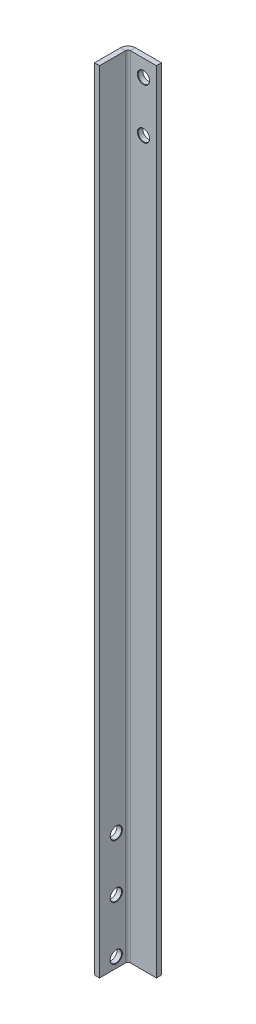
ISO-10303-21;
HEADER;
FILE_DESCRIPTION(('STEP AP214'),'2;1');
FILE_NAME('part.step','',(''),(''),'','','');
FILE_SCHEMA(('AUTOMOTIVE_DESIGN { 1 0 10303 214 1 1 1 1 }'));
ENDSEC;
DATA;
#1=APPLICATION_CONTEXT('core data for automotive mechanical design processes');
#2=APPLICATION_PROTOCOL_DEFINITION('international standard','automotive_design',2000,#1);
#3=PRODUCT_CONTEXT('',#1,'mechanical');
#4=PRODUCT('Part','Part','',(#3));
#5=PRODUCT_RELATED_PRODUCT_CATEGORY('part','',(#4));
#6=PRODUCT_DEFINITION_FORMATION('','',#4);
#7=PRODUCT_DEFINITION_CONTEXT('part definition',#1,'design');
#8=PRODUCT_DEFINITION('design','',#6,#7);
#9=PRODUCT_DEFINITION_SHAPE('','',#8);
#10=(LENGTH_UNIT() NAMED_UNIT(*) SI_UNIT(.MILLI.,.METRE.));
#11=(NAMED_UNIT(*) PLANE_ANGLE_UNIT() SI_UNIT($,.RADIAN.));
#12=(NAMED_UNIT(*) SI_UNIT($,.STERADIAN.) SOLID_ANGLE_UNIT());
#13=UNCERTAINTY_MEASURE_WITH_UNIT(LENGTH_MEASURE(1.E-05),#10,'distance_accuracy_value','');
#14=(GEOMETRIC_REPRESENTATION_CONTEXT(3) GLOBAL_UNCERTAINTY_ASSIGNED_CONTEXT((#13)) GLOBAL_UNIT_ASSIGNED_CONTEXT((#10,
#11,#12)) REPRESENTATION_CONTEXT('',''));
#15=CARTESIAN_POINT('',(0.,0.,0.));
#16=DIRECTION('',(0.,0.,1.));
#17=DIRECTION('',(1.,0.,0.));
#18=AXIS2_PLACEMENT_3D('',#15,#16,#17);
#19=CARTESIAN_POINT('',(2.2366,118.,0.));
#20=DIRECTION('',(0.,1.,0.));
#21=DIRECTION('',(0.,0.,1.));
#22=AXIS2_PLACEMENT_3D('',#19,#20,#21);
#23=PLANE('',#22);
#24=DIRECTION('',(0.,0.,1.));
#25=VECTOR('',#24,1.);
#26=CARTESIAN_POINT('',(2.2366,118.,0.));
#27=LINE('',#26,#25);
#28=CARTESIAN_POINT('',(2.2366,118.,0.));
#29=VERTEX_POINT('',#28);
#30=CARTESIAN_POINT('',(2.2366,118.,1.5));
#31=VERTEX_POINT('',#30);
#32=EDGE_CURVE('E11',#29,#31,#27,.T.);
#33=ORIENTED_EDGE('',*,*,#32,.F.);
#34=CARTESIAN_POINT('',(2.2366,118.,2.2366));
#35=DIRECTION('',(0.,1.,0.));
#36=DIRECTION('',(0.,0.,1.));
#37=AXIS2_PLACEMENT_3D('',#34,#35,#36);
#38=CIRCLE('',#37,2.2366);
#39=CARTESIAN_POINT('',(0.,118.,2.2366));
#40=VERTEX_POINT('',#39);
#41=EDGE_CURVE('E142',#40,#29,#38,.F.);
#42=ORIENTED_EDGE('',*,*,#41,.F.);
#43=DIRECTION('',(-1.,0.,0.));
#44=VECTOR('',#43,1.);
#45=CARTESIAN_POINT('',(1.5,118.,2.2366));
#46=LINE('',#45,#44);
#47=CARTESIAN_POINT('',(1.5,118.,2.2366));
#48=VERTEX_POINT('',#47);
#49=EDGE_CURVE('E53',#48,#40,#46,.T.);
#50=ORIENTED_EDGE('',*,*,#49,.F.);
#51=CARTESIAN_POINT('',(2.2366,118.,2.2366));
#52=DIRECTION('',(0.,1.,0.));
#53=DIRECTION('',(1.,0.,0.));
#54=AXIS2_PLACEMENT_3D('',#51,#52,#53);
#55=CIRCLE('',#54,0.7366);
#56=EDGE_CURVE('E135',#48,#31,#55,.F.);
#57=ORIENTED_EDGE('',*,*,#56,.T.);
#58=EDGE_LOOP('',(#33,#42,#50,#57));
#59=FACE_BOUND('',#58,.T.);
#60=ADVANCED_FACE('F45',(#59),#23,.T.);
#61=CARTESIAN_POINT('',(1.5,118.,2.2366));
#62=DIRECTION('',(0.,1.,0.));
#63=DIRECTION('',(0.,0.,1.));
#64=AXIS2_PLACEMENT_3D('',#61,#62,#63);
#65=PLANE('',#64);
#66=DIRECTION('',(1.,0.,0.));
#67=VECTOR('',#66,1.);
#68=CARTESIAN_POINT('',(0.,118.,0.));
#69=LINE('',#68,#67);
#70=CARTESIAN_POINT('',(10.,118.,0.));
#71=VERTEX_POINT('',#70);
#72=EDGE_CURVE('E192',#29,#71,#69,.T.);
#73=ORIENTED_EDGE('',*,*,#72,.F.);
#74=ORIENTED_EDGE('',*,*,#32,.T.);
#75=DIRECTION('',(1.,0.,0.));
#76=VECTOR('',#75,1.);
#77=CARTESIAN_POINT('',(0.,118.,1.5));
#78=LINE('',#77,#76);
#79=CARTESIAN_POINT('',(10.,118.,1.5));
#80=VERTEX_POINT('',#79);
#81=EDGE_CURVE('E101',#31,#80,#78,.T.);
#82=ORIENTED_EDGE('',*,*,#81,.T.);
#83=DIRECTION('',(0.,0.,1.));
#84=VECTOR('',#83,1.);
#85=CARTESIAN_POINT('',(10.,118.,0.));
#86=LINE('',#85,#84);
#87=EDGE_CURVE('E481',#71,#80,#86,.T.);
#88=ORIENTED_EDGE('',*,*,#87,.F.);
#89=EDGE_LOOP('',(#73,#74,#82,#88));
#90=FACE_BOUND('',#89,.T.);
#91=ADVANCED_FACE('F200',(#90),#65,.T.);
#92=CARTESIAN_POINT('',(0.,-118.,2.2366));
#93=DIRECTION('',(0.,-1.,0.));
#94=DIRECTION('',(0.,0.,-1.));
#95=AXIS2_PLACEMENT_3D('',#92,#93,#94);
#96=PLANE('',#95);
#97=DIRECTION('',(1.,0.,0.));
#98=VECTOR('',#97,1.);
#99=CARTESIAN_POINT('',(0.,-118.,2.2366));
#100=LINE('',#99,#98);
#101=CARTESIAN_POINT('',(0.,-118.,2.2366));
#102=VERTEX_POINT('',#101);
#103=CARTESIAN_POINT('',(1.5,-118.,2.2366));
#104=VERTEX_POINT('',#103);
#105=EDGE_CURVE('E88',#102,#104,#100,.T.);
#106=ORIENTED_EDGE('',*,*,#105,.F.);
#107=CARTESIAN_POINT('',(2.2366,-118.,2.2366));
#108=DIRECTION('',(0.,1.,0.));
#109=DIRECTION('',(0.,0.,1.));
#110=AXIS2_PLACEMENT_3D('',#107,#108,#109);
#111=CIRCLE('',#110,2.2366);
#112=CARTESIAN_POINT('',(2.2366,-118.,0.));
#113=VERTEX_POINT('',#112);
#114=EDGE_CURVE('E158',#102,#113,#111,.F.);
#115=ORIENTED_EDGE('',*,*,#114,.T.);
#116=DIRECTION('',(0.,0.,-1.));
#117=VECTOR('',#116,1.);
#118=CARTESIAN_POINT('',(2.2366,-118.,1.5));
#119=LINE('',#118,#117);
#120=CARTESIAN_POINT('',(2.2366,-118.,1.5));
#121=VERTEX_POINT('',#120);
#122=EDGE_CURVE('E95',#121,#113,#119,.T.);
#123=ORIENTED_EDGE('',*,*,#122,.F.);
#124=CARTESIAN_POINT('',(2.2366,-118.,2.2366));
#125=DIRECTION('',(0.,1.,0.));
#126=DIRECTION('',(1.,0.,0.));
#127=AXIS2_PLACEMENT_3D('',#124,#125,#126);
#128=CIRCLE('',#127,0.7366);
#129=EDGE_CURVE('E165',#104,#121,#128,.F.);
#130=ORIENTED_EDGE('',*,*,#129,.F.);
#131=EDGE_LOOP('',(#106,#115,#123,#130));
#132=FACE_BOUND('',#131,.T.);
#133=ADVANCED_FACE('F198',(#132),#96,.T.);
#134=CARTESIAN_POINT('',(2.2366,-118.,1.5));
#135=DIRECTION('',(0.,-1.,0.));
#136=DIRECTION('',(0.,0.,-1.));
#137=AXIS2_PLACEMENT_3D('',#134,#135,#136);
#138=PLANE('',#137);
#139=DIRECTION('',(0.,0.,-1.));
#140=VECTOR('',#139,1.);
#141=CARTESIAN_POINT('',(0.,-118.,10.));
#142=LINE('',#141,#140);
#143=CARTESIAN_POINT('',(0.,-118.,10.));
#144=VERTEX_POINT('',#143);
#145=EDGE_CURVE('E160',#144,#102,#142,.T.);
#146=ORIENTED_EDGE('',*,*,#145,.T.);
#147=ORIENTED_EDGE('',*,*,#105,.T.);
#148=DIRECTION('',(0.,0.,-1.));
#149=VECTOR('',#148,1.);
#150=CARTESIAN_POINT('',(1.5,-118.,10.));
#151=LINE('',#150,#149);
#152=CARTESIAN_POINT('',(1.5,-118.,10.));
#153=VERTEX_POINT('',#152);
#154=EDGE_CURVE('E163',#153,#104,#151,.T.);
#155=ORIENTED_EDGE('',*,*,#154,.F.);
#156=DIRECTION('',(-1.,0.,0.));
#157=VECTOR('',#156,1.);
#158=CARTESIAN_POINT('',(1.5,-118.,10.));
#159=LINE('',#158,#157);
#160=EDGE_CURVE('E123',#153,#144,#159,.T.);
#161=ORIENTED_EDGE('',*,*,#160,.T.);
#162=EDGE_LOOP('',(#146,#147,#155,#161));
#163=FACE_BOUND('',#162,.T.);
#164=ADVANCED_FACE('F194',(#163),#138,.T.);
#165=CARTESIAN_POINT('',(0.,118.,1.5));
#166=DIRECTION('',(0.,0.,-1.));
#167=DIRECTION('',(-1.,0.,0.));
#168=AXIS2_PLACEMENT_3D('',#165,#166,#167);
#169=PLANE('',#168);
#170=CARTESIAN_POINT('',(6.1183,113.,1.5));
#171=DIRECTION('',(0.,0.,1.));
#172=DIRECTION('',(1.,0.,0.));
#173=AXIS2_PLACEMENT_3D('',#170,#171,#172);
#174=CIRCLE('',#173,1.825);
#175=CARTESIAN_POINT('',(7.9433,113.,1.5));
#176=VERTEX_POINT('',#175);
#177=EDGE_CURVE('E463',#176,#176,#174,.T.);
#178=ORIENTED_EDGE('',*,*,#177,.F.);
#179=EDGE_LOOP('',(#178));
#180=FACE_BOUND('',#179,.T.);
#181=CARTESIAN_POINT('',(6.1183,98.,1.5));
#182=DIRECTION('',(0.,0.,1.));
#183=DIRECTION('',(1.,0.,0.));
#184=AXIS2_PLACEMENT_3D('',#181,#182,#183);
#185=CIRCLE('',#184,1.825);
#186=CARTESIAN_POINT('',(7.9433,98.,1.5));
#187=VERTEX_POINT('',#186);
#188=EDGE_CURVE('E472',#187,#187,#185,.T.);
#189=ORIENTED_EDGE('',*,*,#188,.F.);
#190=EDGE_LOOP('',(#189));
#191=FACE_BOUND('',#190,.T.);
#192=DIRECTION('',(1.,0.,0.));
#193=VECTOR('',#192,1.);
#194=CARTESIAN_POINT('',(0.,-118.,1.5));
#195=LINE('',#194,#193);
#196=CARTESIAN_POINT('',(10.,-118.,1.5));
#197=VERTEX_POINT('',#196);
#198=EDGE_CURVE('E148',#121,#197,#195,.T.);
#199=ORIENTED_EDGE('',*,*,#198,.T.);
#200=DIRECTION('',(0.,-1.,0.));
#201=VECTOR('',#200,1.);
#202=CARTESIAN_POINT('',(10.,118.,1.5));
#203=LINE('',#202,#201);
#204=EDGE_CURVE('E179',#80,#197,#203,.T.);
#205=ORIENTED_EDGE('',*,*,#204,.F.);
#206=ORIENTED_EDGE('',*,*,#81,.F.);
#207=DIRECTION('',(0.,-1.,0.));
#208=VECTOR('',#207,1.);
#209=CARTESIAN_POINT('',(2.2366,118.,1.5));
#210=LINE('',#209,#208);
#211=EDGE_CURVE('E147',#31,#121,#210,.T.);
#212=ORIENTED_EDGE('',*,*,#211,.T.);
#213=EDGE_LOOP('',(#199,#205,#206,#212));
#214=FACE_BOUND('',#213,.T.);
#215=ADVANCED_FACE('F206',(#180,#191,#214),#169,.F.);
#216=CARTESIAN_POINT('',(10.,118.,0.));
#217=DIRECTION('',(1.,0.,0.));
#218=DIRECTION('',(0.,0.,-1.));
#219=AXIS2_PLACEMENT_3D('',#216,#217,#218);
#220=PLANE('',#219);
#221=DIRECTION('',(0.,0.,1.));
#222=VECTOR('',#221,1.);
#223=CARTESIAN_POINT('',(10.,-118.,0.));
#224=LINE('',#223,#222);
#225=CARTESIAN_POINT('',(10.,-118.,0.));
#226=VERTEX_POINT('',#225);
#227=EDGE_CURVE('E151',#226,#197,#224,.T.);
#228=ORIENTED_EDGE('',*,*,#227,.F.);
#229=DIRECTION('',(0.,-1.,0.));
#230=VECTOR('',#229,1.);
#231=CARTESIAN_POINT('',(10.,118.,0.));
#232=LINE('',#231,#230);
#233=EDGE_CURVE('E177',#71,#226,#232,.T.);
#234=ORIENTED_EDGE('',*,*,#233,.F.);
#235=ORIENTED_EDGE('',*,*,#87,.T.);
#236=ORIENTED_EDGE('',*,*,#204,.T.);
#237=EDGE_LOOP('',(#228,#234,#235,#236));
#238=FACE_BOUND('',#237,.T.);
#239=ADVANCED_FACE('F240',(#238),#220,.T.);
#240=CARTESIAN_POINT('',(0.,118.,0.));
#241=DIRECTION('',(0.,0.,-1.));
#242=DIRECTION('',(-1.,0.,0.));
#243=AXIS2_PLACEMENT_3D('',#240,#241,#242);
#244=PLANE('',#243);
#245=CARTESIAN_POINT('',(6.1183,113.,0.));
#246=DIRECTION('',(0.,0.,1.));
#247=DIRECTION('',(1.,0.,0.));
#248=AXIS2_PLACEMENT_3D('',#245,#246,#247);
#249=CIRCLE('',#248,1.7);
#250=CARTESIAN_POINT('',(7.8183,113.,0.));
#251=VERTEX_POINT('',#250);
#252=EDGE_CURVE('E469',#251,#251,#249,.T.);
#253=ORIENTED_EDGE('',*,*,#252,.T.);
#254=EDGE_LOOP('',(#253));
#255=FACE_BOUND('',#254,.T.);
#256=CARTESIAN_POINT('',(6.1183,98.,0.));
#257=DIRECTION('',(0.,0.,1.));
#258=DIRECTION('',(1.,0.,0.));
#259=AXIS2_PLACEMENT_3D('',#256,#257,#258);
#260=CIRCLE('',#259,1.7);
#261=CARTESIAN_POINT('',(7.8183,98.,0.));
#262=VERTEX_POINT('',#261);
#263=EDGE_CURVE('E152',#262,#262,#260,.T.);
#264=ORIENTED_EDGE('',*,*,#263,.T.);
#265=EDGE_LOOP('',(#264));
#266=FACE_BOUND('',#265,.T.);
#267=DIRECTION('',(1.,0.,0.));
#268=VECTOR('',#267,1.);
#269=CARTESIAN_POINT('',(0.,-118.,0.));
#270=LINE('',#269,#268);
#271=EDGE_CURVE('E155',#113,#226,#270,.T.);
#272=ORIENTED_EDGE('',*,*,#271,.F.);
#273=DIRECTION('',(0.,-1.,0.));
#274=VECTOR('',#273,1.);
#275=CARTESIAN_POINT('',(2.2366,118.,0.));
#276=LINE('',#275,#274);
#277=EDGE_CURVE('E174',#29,#113,#276,.T.);
#278=ORIENTED_EDGE('',*,*,#277,.F.);
#279=ORIENTED_EDGE('',*,*,#72,.T.);
#280=ORIENTED_EDGE('',*,*,#233,.T.);
#281=EDGE_LOOP('',(#272,#278,#279,#280));
#282=FACE_BOUND('',#281,.T.);
#283=ADVANCED_FACE('F252',(#255,#266,#282),#244,.T.);
#284=CARTESIAN_POINT('',(2.2366,118.,2.2366));
#285=DIRECTION('',(0.,-1.,0.));
#286=DIRECTION('',(0.,0.,-1.));
#287=AXIS2_PLACEMENT_3D('',#284,#285,#286);
#288=CYLINDRICAL_SURFACE('',#287,2.2366);
#289=ORIENTED_EDGE('',*,*,#114,.F.);
#290=DIRECTION('',(0.,-1.,0.));
#291=VECTOR('',#290,1.);
#292=CARTESIAN_POINT('',(0.,118.,2.2366));
#293=LINE('',#292,#291);
#294=EDGE_CURVE('E171',#40,#102,#293,.T.);
#295=ORIENTED_EDGE('',*,*,#294,.F.);
#296=ORIENTED_EDGE('',*,*,#41,.T.);
#297=ORIENTED_EDGE('',*,*,#277,.T.);
#298=EDGE_LOOP('',(#289,#295,#296,#297));
#299=FACE_BOUND('',#298,.T.);
#300=ADVANCED_FACE('F188',(#299),#288,.T.);
#301=CARTESIAN_POINT('',(0.,118.,10.));
#302=DIRECTION('',(-1.,0.,0.));
#303=DIRECTION('',(0.,0.,1.));
#304=AXIS2_PLACEMENT_3D('',#301,#302,#303);
#305=PLANE('',#304);
#306=CARTESIAN_POINT('',(0.,-115.,5.));
#307=DIRECTION('',(1.,0.,0.));
#308=DIRECTION('',(0.,0.,-1.));
#309=AXIS2_PLACEMENT_3D('',#306,#307,#308);
#310=CIRCLE('',#309,1.69999999999999);
#311=CARTESIAN_POINT('',(0.,-115.,3.30000000000001));
#312=VERTEX_POINT('',#311);
#313=EDGE_CURVE('E440',#312,#312,#310,.T.);
#314=ORIENTED_EDGE('',*,*,#313,.T.);
#315=EDGE_LOOP('',(#314));
#316=FACE_BOUND('',#315,.T.);
#317=CARTESIAN_POINT('',(0.,-99.,5.));
#318=DIRECTION('',(1.,0.,0.));
#319=DIRECTION('',(0.,0.,-1.));
#320=AXIS2_PLACEMENT_3D('',#317,#318,#319);
#321=CIRCLE('',#320,1.69999999999999);
#322=CARTESIAN_POINT('',(0.,-99.,3.30000000000001));
#323=VERTEX_POINT('',#322);
#324=EDGE_CURVE('E451',#323,#323,#321,.T.);
#325=ORIENTED_EDGE('',*,*,#324,.T.);
#326=EDGE_LOOP('',(#325));
#327=FACE_BOUND('',#326,.T.);
#328=CARTESIAN_POINT('',(0.,-83.,5.));
#329=DIRECTION('',(1.,0.,0.));
#330=DIRECTION('',(0.,0.,-1.));
#331=AXIS2_PLACEMENT_3D('',#328,#329,#330);
#332=CIRCLE('',#331,1.69999999999999);
#333=CARTESIAN_POINT('',(0.,-83.,3.30000000000001));
#334=VERTEX_POINT('',#333);
#335=EDGE_CURVE('E460',#334,#334,#332,.T.);
#336=ORIENTED_EDGE('',*,*,#335,.T.);
#337=EDGE_LOOP('',(#336));
#338=FACE_BOUND('',#337,.T.);
#339=ORIENTED_EDGE('',*,*,#145,.F.);
#340=DIRECTION('',(0.,-1.,0.));
#341=VECTOR('',#340,1.);
#342=CARTESIAN_POINT('',(0.,118.,10.));
#343=LINE('',#342,#341);
#344=CARTESIAN_POINT('',(0.,118.,10.));
#345=VERTEX_POINT('',#344);
#346=EDGE_CURVE('E125',#345,#144,#343,.T.);
#347=ORIENTED_EDGE('',*,*,#346,.F.);
#348=DIRECTION('',(0.,0.,-1.));
#349=VECTOR('',#348,1.);
#350=CARTESIAN_POINT('',(0.,118.,10.));
#351=LINE('',#350,#349);
#352=EDGE_CURVE('E140',#345,#40,#351,.T.);
#353=ORIENTED_EDGE('',*,*,#352,.T.);
#354=ORIENTED_EDGE('',*,*,#294,.T.);
#355=EDGE_LOOP('',(#339,#347,#353,#354));
#356=FACE_BOUND('',#355,.T.);
#357=ADVANCED_FACE('F193',(#316,#327,#338,#356),#305,.T.);
#358=CARTESIAN_POINT('',(1.5,118.,10.));
#359=DIRECTION('',(0.,0.,1.));
#360=DIRECTION('',(1.,0.,0.));
#361=AXIS2_PLACEMENT_3D('',#358,#359,#360);
#362=PLANE('',#361);
#363=ORIENTED_EDGE('',*,*,#160,.F.);
#364=DIRECTION('',(0.,-1.,0.));
#365=VECTOR('',#364,1.);
#366=CARTESIAN_POINT('',(1.5,118.,10.));
#367=LINE('',#366,#365);
#368=CARTESIAN_POINT('',(1.5,118.,10.));
#369=VERTEX_POINT('',#368);
#370=EDGE_CURVE('E117',#369,#153,#367,.T.);
#371=ORIENTED_EDGE('',*,*,#370,.F.);
#372=DIRECTION('',(-1.,0.,0.));
#373=VECTOR('',#372,1.);
#374=CARTESIAN_POINT('',(1.5,118.,10.));
#375=LINE('',#374,#373);
#376=EDGE_CURVE('E121',#369,#345,#375,.T.);
#377=ORIENTED_EDGE('',*,*,#376,.T.);
#378=ORIENTED_EDGE('',*,*,#346,.T.);
#379=EDGE_LOOP('',(#363,#371,#377,#378));
#380=FACE_BOUND('',#379,.T.);
#381=ADVANCED_FACE('F119',(#380),#362,.T.);
#382=CARTESIAN_POINT('',(1.5,118.,10.));
#383=DIRECTION('',(-1.,0.,0.));
#384=DIRECTION('',(0.,0.,1.));
#385=AXIS2_PLACEMENT_3D('',#382,#383,#384);
#386=PLANE('',#385);
#387=CARTESIAN_POINT('',(1.5,-115.,5.));
#388=DIRECTION('',(1.,0.,0.));
#389=DIRECTION('',(0.,0.,-1.));
#390=AXIS2_PLACEMENT_3D('',#387,#388,#389);
#391=CIRCLE('',#390,1.82499999999999);
#392=CARTESIAN_POINT('',(1.5,-115.,3.17500000000001));
#393=VERTEX_POINT('',#392);
#394=EDGE_CURVE('E438',#393,#393,#391,.T.);
#395=ORIENTED_EDGE('',*,*,#394,.F.);
#396=EDGE_LOOP('',(#395));
#397=FACE_BOUND('',#396,.T.);
#398=CARTESIAN_POINT('',(1.5,-99.,5.));
#399=DIRECTION('',(1.,0.,0.));
#400=DIRECTION('',(0.,0.,-1.));
#401=AXIS2_PLACEMENT_3D('',#398,#399,#400);
#402=CIRCLE('',#401,1.82500000000001);
#403=CARTESIAN_POINT('',(1.5,-99.,3.17499999999999));
#404=VERTEX_POINT('',#403);
#405=EDGE_CURVE('E445',#404,#404,#402,.T.);
#406=ORIENTED_EDGE('',*,*,#405,.F.);
#407=EDGE_LOOP('',(#406));
#408=FACE_BOUND('',#407,.T.);
#409=CARTESIAN_POINT('',(1.5,-83.,5.));
#410=DIRECTION('',(1.,0.,0.));
#411=DIRECTION('',(0.,0.,-1.));
#412=AXIS2_PLACEMENT_3D('',#409,#410,#411);
#413=CIRCLE('',#412,1.82499999999999);
#414=CARTESIAN_POINT('',(1.5,-83.,3.17500000000001));
#415=VERTEX_POINT('',#414);
#416=EDGE_CURVE('E454',#415,#415,#413,.T.);
#417=ORIENTED_EDGE('',*,*,#416,.F.);
#418=EDGE_LOOP('',(#417));
#419=FACE_BOUND('',#418,.T.);
#420=ORIENTED_EDGE('',*,*,#154,.T.);
#421=DIRECTION('',(0.,-1.,0.));
#422=VECTOR('',#421,1.);
#423=CARTESIAN_POINT('',(1.5,118.,2.2366));
#424=LINE('',#423,#422);
#425=EDGE_CURVE('E126',#48,#104,#424,.T.);
#426=ORIENTED_EDGE('',*,*,#425,.F.);
#427=DIRECTION('',(0.,0.,-1.));
#428=VECTOR('',#427,1.);
#429=CARTESIAN_POINT('',(1.5,118.,10.));
#430=LINE('',#429,#428);
#431=EDGE_CURVE('E130',#369,#48,#430,.T.);
#432=ORIENTED_EDGE('',*,*,#431,.F.);
#433=ORIENTED_EDGE('',*,*,#370,.T.);
#434=EDGE_LOOP('',(#420,#426,#432,#433));
#435=FACE_BOUND('',#434,.T.);
#436=ADVANCED_FACE('F131',(#397,#408,#419,#435),#386,.F.);
#437=CARTESIAN_POINT('',(2.2366,118.,2.2366));
#438=DIRECTION('',(0.,-1.,0.));
#439=DIRECTION('',(0.,0.,-1.));
#440=AXIS2_PLACEMENT_3D('',#437,#438,#439);
#441=CYLINDRICAL_SURFACE('',#440,0.7366);
#442=ORIENTED_EDGE('',*,*,#129,.T.);
#443=ORIENTED_EDGE('',*,*,#211,.F.);
#444=ORIENTED_EDGE('',*,*,#56,.F.);
#445=ORIENTED_EDGE('',*,*,#425,.T.);
#446=EDGE_LOOP('',(#442,#443,#444,#445));
#447=FACE_BOUND('',#446,.T.);
#448=ADVANCED_FACE('F196',(#447),#441,.F.);
#449=CARTESIAN_POINT('',(2.2366,118.,2.2366));
#450=DIRECTION('',(0.,1.,0.));
#451=DIRECTION('',(1.,0.,0.));
#452=AXIS2_PLACEMENT_3D('',#449,#450,#451);
#453=PLANE('',#452);
#454=ORIENTED_EDGE('',*,*,#431,.T.);
#455=ORIENTED_EDGE('',*,*,#49,.T.);
#456=ORIENTED_EDGE('',*,*,#352,.F.);
#457=ORIENTED_EDGE('',*,*,#376,.F.);
#458=EDGE_LOOP('',(#454,#455,#456,#457));
#459=FACE_BOUND('',#458,.T.);
#460=ADVANCED_FACE('F138',(#459),#453,.T.);
#461=CARTESIAN_POINT('',(2.2366,-118.,2.2366));
#462=DIRECTION('',(0.,1.,0.));
#463=DIRECTION('',(1.,0.,0.));
#464=AXIS2_PLACEMENT_3D('',#461,#462,#463);
#465=PLANE('',#464);
#466=ORIENTED_EDGE('',*,*,#198,.F.);
#467=ORIENTED_EDGE('',*,*,#122,.T.);
#468=ORIENTED_EDGE('',*,*,#271,.T.);
#469=ORIENTED_EDGE('',*,*,#227,.T.);
#470=EDGE_LOOP('',(#466,#467,#468,#469));
#471=FACE_BOUND('',#470,.T.);
#472=ADVANCED_FACE('F322',(#471),#465,.F.);
#473=CARTESIAN_POINT('',(6.1183,98.,1.5));
#474=DIRECTION('',(0.,0.,1.));
#475=DIRECTION('',(1.,0.,0.));
#476=AXIS2_PLACEMENT_3D('',#473,#474,#475);
#477=CYLINDRICAL_SURFACE('',#476,1.7);
#478=ORIENTED_EDGE('',*,*,#263,.F.);
#479=EDGE_LOOP('',(#478));
#480=FACE_BOUND('',#479,.T.);
#481=CARTESIAN_POINT('',(6.1183,98.,1.375));
#482=DIRECTION('',(0.,0.,1.));
#483=DIRECTION('',(1.,0.,0.));
#484=AXIS2_PLACEMENT_3D('',#481,#482,#483);
#485=CIRCLE('',#484,1.7);
#486=CARTESIAN_POINT('',(7.8183,98.,1.375));
#487=VERTEX_POINT('',#486);
#488=EDGE_CURVE('E475',#487,#487,#485,.T.);
#489=ORIENTED_EDGE('',*,*,#488,.T.);
#490=EDGE_LOOP('',(#489));
#491=FACE_BOUND('',#490,.T.);
#492=ADVANCED_FACE('F331',(#480,#491),#477,.F.);
#493=CARTESIAN_POINT('',(6.1183,98.,1.5));
#494=DIRECTION('',(0.,0.,1.));
#495=DIRECTION('',(1.,0.,0.));
#496=AXIS2_PLACEMENT_3D('',#493,#494,#495);
#497=CONICAL_SURFACE('',#496,1.825,0.785398163397451);
#498=ORIENTED_EDGE('',*,*,#488,.F.);
#499=EDGE_LOOP('',(#498));
#500=FACE_BOUND('',#499,.T.);
#501=ORIENTED_EDGE('',*,*,#188,.T.);
#502=EDGE_LOOP('',(#501));
#503=FACE_BOUND('',#502,.T.);
#504=ADVANCED_FACE('F341',(#500,#503),#497,.F.);
#505=CARTESIAN_POINT('',(6.1183,113.,1.5));
#506=DIRECTION('',(0.,0.,1.));
#507=DIRECTION('',(1.,0.,0.));
#508=AXIS2_PLACEMENT_3D('',#505,#506,#507);
#509=CYLINDRICAL_SURFACE('',#508,1.7);
#510=ORIENTED_EDGE('',*,*,#252,.F.);
#511=EDGE_LOOP('',(#510));
#512=FACE_BOUND('',#511,.T.);
#513=CARTESIAN_POINT('',(6.1183,113.,1.375));
#514=DIRECTION('',(0.,0.,1.));
#515=DIRECTION('',(1.,0.,0.));
#516=AXIS2_PLACEMENT_3D('',#513,#514,#515);
#517=CIRCLE('',#516,1.7);
#518=CARTESIAN_POINT('',(7.8183,113.,1.375));
#519=VERTEX_POINT('',#518);
#520=EDGE_CURVE('E466',#519,#519,#517,.T.);
#521=ORIENTED_EDGE('',*,*,#520,.T.);
#522=EDGE_LOOP('',(#521));
#523=FACE_BOUND('',#522,.T.);
#524=ADVANCED_FACE('F351',(#512,#523),#509,.F.);
#525=CARTESIAN_POINT('',(6.1183,113.,1.5));
#526=DIRECTION('',(0.,0.,1.));
#527=DIRECTION('',(1.,0.,0.));
#528=AXIS2_PLACEMENT_3D('',#525,#526,#527);
#529=CONICAL_SURFACE('',#528,1.825,0.785398163397451);
#530=ORIENTED_EDGE('',*,*,#520,.F.);
#531=EDGE_LOOP('',(#530));
#532=FACE_BOUND('',#531,.T.);
#533=ORIENTED_EDGE('',*,*,#177,.T.);
#534=EDGE_LOOP('',(#533));
#535=FACE_BOUND('',#534,.T.);
#536=ADVANCED_FACE('F361',(#532,#535),#529,.F.);
#537=CARTESIAN_POINT('',(1.5,-83.,5.));
#538=DIRECTION('',(1.,0.,0.));
#539=DIRECTION('',(0.,0.,-1.));
#540=AXIS2_PLACEMENT_3D('',#537,#538,#539);
#541=CYLINDRICAL_SURFACE('',#540,1.69999999999999);
#542=ORIENTED_EDGE('',*,*,#335,.F.);
#543=EDGE_LOOP('',(#542));
#544=FACE_BOUND('',#543,.T.);
#545=CARTESIAN_POINT('',(1.37499999999999,-83.,5.));
#546=DIRECTION('',(1.,0.,0.));
#547=DIRECTION('',(0.,0.,-1.));
#548=AXIS2_PLACEMENT_3D('',#545,#546,#547);
#549=CIRCLE('',#548,1.69999999999999);
#550=CARTESIAN_POINT('',(1.37499999999999,-83.,3.30000000000001));
#551=VERTEX_POINT('',#550);
#552=EDGE_CURVE('E457',#551,#551,#549,.T.);
#553=ORIENTED_EDGE('',*,*,#552,.T.);
#554=EDGE_LOOP('',(#553));
#555=FACE_BOUND('',#554,.T.);
#556=ADVANCED_FACE('F370',(#544,#555),#541,.F.);
#557=CARTESIAN_POINT('',(1.5,-83.,5.));
#558=DIRECTION('',(1.,0.,0.));
#559=DIRECTION('',(0.,0.,-1.));
#560=AXIS2_PLACEMENT_3D('',#557,#558,#559);
#561=CONICAL_SURFACE('',#560,1.82499999999999,0.785398163397386);
#562=ORIENTED_EDGE('',*,*,#552,.F.);
#563=EDGE_LOOP('',(#562));
#564=FACE_BOUND('',#563,.T.);
#565=ORIENTED_EDGE('',*,*,#416,.T.);
#566=EDGE_LOOP('',(#565));
#567=FACE_BOUND('',#566,.T.);
#568=ADVANCED_FACE('F379',(#564,#567),#561,.F.);
#569=CARTESIAN_POINT('',(1.5,-99.,5.));
#570=DIRECTION('',(1.,0.,0.));
#571=DIRECTION('',(0.,0.,-1.));
#572=AXIS2_PLACEMENT_3D('',#569,#570,#571);
#573=CYLINDRICAL_SURFACE('',#572,1.69999999999999);
#574=ORIENTED_EDGE('',*,*,#324,.F.);
#575=EDGE_LOOP('',(#574));
#576=FACE_BOUND('',#575,.T.);
#577=CARTESIAN_POINT('',(1.37499999999999,-99.,5.));
#578=DIRECTION('',(1.,0.,0.));
#579=DIRECTION('',(0.,0.,-1.));
#580=AXIS2_PLACEMENT_3D('',#577,#578,#579);
#581=CIRCLE('',#580,1.69999999999999);
#582=CARTESIAN_POINT('',(1.37499999999999,-99.,3.30000000000001));
#583=VERTEX_POINT('',#582);
#584=EDGE_CURVE('E448',#583,#583,#581,.T.);
#585=ORIENTED_EDGE('',*,*,#584,.T.);
#586=EDGE_LOOP('',(#585));
#587=FACE_BOUND('',#586,.T.);
#588=ADVANCED_FACE('F389',(#576,#587),#573,.F.);
#589=CARTESIAN_POINT('',(1.5,-99.,5.));
#590=DIRECTION('',(1.,0.,0.));
#591=DIRECTION('',(0.,0.,-1.));
#592=AXIS2_PLACEMENT_3D('',#589,#590,#591);
#593=CONICAL_SURFACE('',#592,1.82500000000001,0.785398163397442);
#594=ORIENTED_EDGE('',*,*,#584,.F.);
#595=EDGE_LOOP('',(#594));
#596=FACE_BOUND('',#595,.T.);
#597=ORIENTED_EDGE('',*,*,#405,.T.);
#598=EDGE_LOOP('',(#597));
#599=FACE_BOUND('',#598,.T.);
#600=ADVANCED_FACE('F399',(#596,#599),#593,.F.);
#601=CARTESIAN_POINT('',(1.5,-115.,5.));
#602=DIRECTION('',(1.,0.,0.));
#603=DIRECTION('',(0.,0.,-1.));
#604=AXIS2_PLACEMENT_3D('',#601,#602,#603);
#605=CYLINDRICAL_SURFACE('',#604,1.69999999999999);
#606=ORIENTED_EDGE('',*,*,#313,.F.);
#607=EDGE_LOOP('',(#606));
#608=FACE_BOUND('',#607,.T.);
#609=CARTESIAN_POINT('',(1.37499999999999,-115.,5.));
#610=DIRECTION('',(1.,0.,0.));
#611=DIRECTION('',(0.,0.,-1.));
#612=AXIS2_PLACEMENT_3D('',#609,#610,#611);
#613=CIRCLE('',#612,1.69999999999999);
#614=CARTESIAN_POINT('',(1.37499999999999,-115.,3.30000000000001));
#615=VERTEX_POINT('',#614);
#616=EDGE_CURVE('E435',#615,#615,#613,.T.);
#617=ORIENTED_EDGE('',*,*,#616,.T.);
#618=EDGE_LOOP('',(#617));
#619=FACE_BOUND('',#618,.T.);
#620=ADVANCED_FACE('F409',(#608,#619),#605,.F.);
#621=CARTESIAN_POINT('',(1.5,-115.,5.));
#622=DIRECTION('',(1.,0.,0.));
#623=DIRECTION('',(0.,0.,-1.));
#624=AXIS2_PLACEMENT_3D('',#621,#622,#623);
#625=CONICAL_SURFACE('',#624,1.82499999999999,0.785398163397386);
#626=ORIENTED_EDGE('',*,*,#616,.F.);
#627=EDGE_LOOP('',(#626));
#628=FACE_BOUND('',#627,.T.);
#629=ORIENTED_EDGE('',*,*,#394,.T.);
#630=EDGE_LOOP('',(#629));
#631=FACE_BOUND('',#630,.T.);
#632=ADVANCED_FACE('F419',(#628,#631),#625,.F.);
#633=CLOSED_SHELL('',(#60,#91,#133,#164,#215,#239,#283,#300,#357,#381,#436,#448,#460,#472,#492,
#504,#524,#536,#556,#568,#588,#600,#620,#632));
#634=MANIFOLD_SOLID_BREP('B2',#633);
#635=ADVANCED_BREP_SHAPE_REPRESENTATION('',(#18,#634),#14);
#636=SHAPE_DEFINITION_REPRESENTATION(#9,#635);
ENDSEC;
END-ISO-10303-21;
